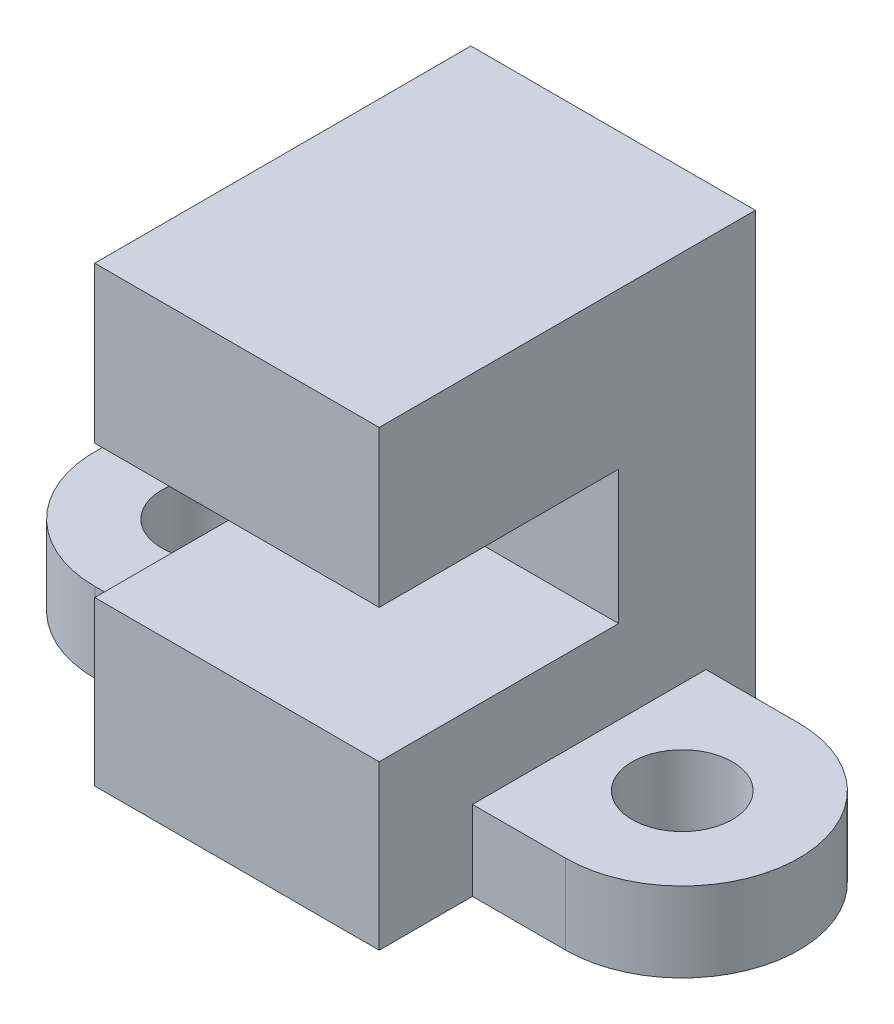
ISO-10303-21;
HEADER;
FILE_DESCRIPTION(('STEP AP214'),'2;1');
FILE_NAME('part.step','',(''),(''),'','','');
FILE_SCHEMA(('AUTOMOTIVE_DESIGN { 1 0 10303 214 1 1 1 1 }'));
ENDSEC;
DATA;
#1=APPLICATION_CONTEXT('core data for automotive mechanical design processes');
#2=APPLICATION_PROTOCOL_DEFINITION('international standard','automotive_design',2000,#1);
#3=PRODUCT_CONTEXT('',#1,'mechanical');
#4=PRODUCT('Part','Part','',(#3));
#5=PRODUCT_RELATED_PRODUCT_CATEGORY('part','',(#4));
#6=PRODUCT_DEFINITION_FORMATION('','',#4);
#7=PRODUCT_DEFINITION_CONTEXT('part definition',#1,'design');
#8=PRODUCT_DEFINITION('design','',#6,#7);
#9=PRODUCT_DEFINITION_SHAPE('','',#8);
#10=(LENGTH_UNIT() NAMED_UNIT(*) SI_UNIT(.MILLI.,.METRE.));
#11=(NAMED_UNIT(*) PLANE_ANGLE_UNIT() SI_UNIT($,.RADIAN.));
#12=(NAMED_UNIT(*) SI_UNIT($,.STERADIAN.) SOLID_ANGLE_UNIT());
#13=UNCERTAINTY_MEASURE_WITH_UNIT(LENGTH_MEASURE(1.E-05),#10,'distance_accuracy_value','');
#14=(GEOMETRIC_REPRESENTATION_CONTEXT(3) GLOBAL_UNCERTAINTY_ASSIGNED_CONTEXT((#13)) GLOBAL_UNIT_ASSIGNED_CONTEXT((#10,
#11,#12)) REPRESENTATION_CONTEXT('',''));
#15=CARTESIAN_POINT('',(0.,0.,0.));
#16=DIRECTION('',(0.,0.,1.));
#17=DIRECTION('',(1.,0.,0.));
#18=AXIS2_PLACEMENT_3D('',#15,#16,#17);
#19=CARTESIAN_POINT('',(-3.66,5.825,3.52));
#20=DIRECTION('',(1.,0.,0.));
#21=DIRECTION('',(0.,1.,0.));
#22=AXIS2_PLACEMENT_3D('',#19,#20,#21);
#23=PLANE('',#22);
#24=DIRECTION('',(0.,-1.,0.));
#25=VECTOR('',#24,1.);
#26=CARTESIAN_POINT('',(-3.66,-3.775,1.27));
#27=LINE('',#26,#25);
#28=CARTESIAN_POINT('',(-3.66,-3.775,1.27));
#29=VERTEX_POINT('',#28);
#30=CARTESIAN_POINT('',(-3.66,-5.825,1.27));
#31=VERTEX_POINT('',#30);
#32=EDGE_CURVE('E163',#29,#31,#27,.T.);
#33=ORIENTED_EDGE('',*,*,#32,.F.);
#34=DIRECTION('',(0.,0.,-1.));
#35=VECTOR('',#34,1.);
#36=CARTESIAN_POINT('',(-3.66,-3.775,0.));
#37=LINE('',#36,#35);
#38=CARTESIAN_POINT('',(-3.66,-3.775,7.28));
#39=VERTEX_POINT('',#38);
#40=EDGE_CURVE('E177',#39,#29,#37,.T.);
#41=ORIENTED_EDGE('',*,*,#40,.F.);
#42=DIRECTION('',(0.,-1.,0.));
#43=VECTOR('',#42,1.);
#44=CARTESIAN_POINT('',(-3.66,-3.775,7.28));
#45=LINE('',#44,#43);
#46=CARTESIAN_POINT('',(-3.66,-5.825,7.28));
#47=VERTEX_POINT('',#46);
#48=EDGE_CURVE('E193',#39,#47,#45,.T.);
#49=ORIENTED_EDGE('',*,*,#48,.T.);
#50=DIRECTION('',(0.,0.,-1.));
#51=VECTOR('',#50,1.);
#52=CARTESIAN_POINT('',(-3.66,-5.825,3.52));
#53=LINE('',#52,#51);
#54=CARTESIAN_POINT('',(-3.66,-5.825,9.68));
#55=VERTEX_POINT('',#54);
#56=EDGE_CURVE('E285',#55,#47,#53,.T.);
#57=ORIENTED_EDGE('',*,*,#56,.F.);
#58=DIRECTION('',(0.,-1.,0.));
#59=VECTOR('',#58,1.);
#60=CARTESIAN_POINT('',(-3.66,-5.825,9.68));
#61=LINE('',#60,#59);
#62=CARTESIAN_POINT('',(-3.66,-1.625,9.68));
#63=VERTEX_POINT('',#62);
#64=EDGE_CURVE('E247',#63,#55,#61,.T.);
#65=ORIENTED_EDGE('',*,*,#64,.F.);
#66=DIRECTION('',(0.,0.,-1.));
#67=VECTOR('',#66,1.);
#68=CARTESIAN_POINT('',(-3.66,-1.625,9.68));
#69=LINE('',#68,#67);
#70=CARTESIAN_POINT('',(-3.66,-1.625,3.52));
#71=VERTEX_POINT('',#70);
#72=EDGE_CURVE('E257',#63,#71,#69,.T.);
#73=ORIENTED_EDGE('',*,*,#72,.T.);
#74=DIRECTION('',(0.,-1.,0.));
#75=VECTOR('',#74,1.);
#76=CARTESIAN_POINT('',(-3.66,5.825,3.52));
#77=LINE('',#76,#75);
#78=CARTESIAN_POINT('',(-3.66,1.815,3.52));
#79=VERTEX_POINT('',#78);
#80=EDGE_CURVE('E268',#79,#71,#77,.T.);
#81=ORIENTED_EDGE('',*,*,#80,.F.);
#82=DIRECTION('',(0.,0.,-1.));
#83=VECTOR('',#82,1.);
#84=CARTESIAN_POINT('',(-3.66,1.815,9.68));
#85=LINE('',#84,#83);
#86=CARTESIAN_POINT('',(-3.66,1.815,9.68));
#87=VERTEX_POINT('',#86);
#88=EDGE_CURVE('E243',#87,#79,#85,.T.);
#89=ORIENTED_EDGE('',*,*,#88,.F.);
#90=DIRECTION('',(0.,-1.,0.));
#91=VECTOR('',#90,1.);
#92=CARTESIAN_POINT('',(-3.66,5.825,9.68));
#93=LINE('',#92,#91);
#94=CARTESIAN_POINT('',(-3.66,5.825,9.68));
#95=VERTEX_POINT('',#94);
#96=EDGE_CURVE('E227',#95,#87,#93,.T.);
#97=ORIENTED_EDGE('',*,*,#96,.F.);
#98=DIRECTION('',(0.,0.,-1.));
#99=VECTOR('',#98,1.);
#100=CARTESIAN_POINT('',(-3.66,5.825,3.52));
#101=LINE('',#100,#99);
#102=CARTESIAN_POINT('',(-3.66,5.825,0.));
#103=VERTEX_POINT('',#102);
#104=EDGE_CURVE('E45',#95,#103,#101,.T.);
#105=ORIENTED_EDGE('',*,*,#104,.T.);
#106=DIRECTION('',(0.,-1.,0.));
#107=VECTOR('',#106,1.);
#108=CARTESIAN_POINT('',(-3.66,5.825,0.));
#109=LINE('',#108,#107);
#110=CARTESIAN_POINT('',(-3.66,-5.825,0.));
#111=VERTEX_POINT('',#110);
#112=EDGE_CURVE('E276',#103,#111,#109,.T.);
#113=ORIENTED_EDGE('',*,*,#112,.T.);
#114=EDGE_CURVE('E284',#31,#111,#53,.T.);
#115=ORIENTED_EDGE('',*,*,#114,.F.);
#116=EDGE_LOOP('',(#33,#41,#49,#57,#65,#73,#81,#89,#97,#105,#113,#115));
#117=FACE_BOUND('',#116,.T.);
#118=ADVANCED_FACE('F37',(#117),#23,.F.);
#119=CARTESIAN_POINT('',(3.66,5.825,3.52));
#120=DIRECTION('',(-1.,0.,0.));
#121=DIRECTION('',(0.,-1.,0.));
#122=AXIS2_PLACEMENT_3D('',#119,#120,#121);
#123=PLANE('',#122);
#124=DIRECTION('',(0.,-1.,0.));
#125=VECTOR('',#124,1.);
#126=CARTESIAN_POINT('',(3.66,-3.775,7.28));
#127=LINE('',#126,#125);
#128=CARTESIAN_POINT('',(3.66,-3.775,7.28));
#129=VERTEX_POINT('',#128);
#130=CARTESIAN_POINT('',(3.66,-5.825,7.28));
#131=VERTEX_POINT('',#130);
#132=EDGE_CURVE('E222',#129,#131,#127,.T.);
#133=ORIENTED_EDGE('',*,*,#132,.F.);
#134=DIRECTION('',(0.,0.,1.));
#135=VECTOR('',#134,1.);
#136=CARTESIAN_POINT('',(3.66,-3.775,0.));
#137=LINE('',#136,#135);
#138=CARTESIAN_POINT('',(3.66,-3.775,1.27));
#139=VERTEX_POINT('',#138);
#140=EDGE_CURVE('E208',#139,#129,#137,.T.);
#141=ORIENTED_EDGE('',*,*,#140,.F.);
#142=DIRECTION('',(0.,-1.,0.));
#143=VECTOR('',#142,1.);
#144=CARTESIAN_POINT('',(3.66,-3.775,1.27));
#145=LINE('',#144,#143);
#146=CARTESIAN_POINT('',(3.66,-5.825,1.27));
#147=VERTEX_POINT('',#146);
#148=EDGE_CURVE('E219',#139,#147,#145,.T.);
#149=ORIENTED_EDGE('',*,*,#148,.T.);
#150=DIRECTION('',(0.,0.,-1.));
#151=VECTOR('',#150,1.);
#152=CARTESIAN_POINT('',(3.66,-5.825,3.52));
#153=LINE('',#152,#151);
#154=CARTESIAN_POINT('',(3.66,-5.825,0.));
#155=VERTEX_POINT('',#154);
#156=EDGE_CURVE('E271',#147,#155,#153,.T.);
#157=ORIENTED_EDGE('',*,*,#156,.T.);
#158=DIRECTION('',(0.,1.,0.));
#159=VECTOR('',#158,1.);
#160=CARTESIAN_POINT('',(3.66,5.825,0.));
#161=LINE('',#160,#159);
#162=CARTESIAN_POINT('',(3.66,5.825,0.));
#163=VERTEX_POINT('',#162);
#164=EDGE_CURVE('E265',#155,#163,#161,.T.);
#165=ORIENTED_EDGE('',*,*,#164,.T.);
#166=DIRECTION('',(0.,0.,-1.));
#167=VECTOR('',#166,1.);
#168=CARTESIAN_POINT('',(3.66,5.825,3.52));
#169=LINE('',#168,#167);
#170=CARTESIAN_POINT('',(3.66,5.825,9.68));
#171=VERTEX_POINT('',#170);
#172=EDGE_CURVE('E11',#171,#163,#169,.T.);
#173=ORIENTED_EDGE('',*,*,#172,.F.);
#174=DIRECTION('',(0.,1.,0.));
#175=VECTOR('',#174,1.);
#176=CARTESIAN_POINT('',(3.66,5.825,9.68));
#177=LINE('',#176,#175);
#178=CARTESIAN_POINT('',(3.66,1.815,9.68));
#179=VERTEX_POINT('',#178);
#180=EDGE_CURVE('E232',#179,#171,#177,.T.);
#181=ORIENTED_EDGE('',*,*,#180,.F.);
#182=DIRECTION('',(0.,0.,-1.));
#183=VECTOR('',#182,1.);
#184=CARTESIAN_POINT('',(3.66,1.815,9.68));
#185=LINE('',#184,#183);
#186=CARTESIAN_POINT('',(3.66,1.815,3.52));
#187=VERTEX_POINT('',#186);
#188=EDGE_CURVE('E238',#179,#187,#185,.T.);
#189=ORIENTED_EDGE('',*,*,#188,.T.);
#190=DIRECTION('',(0.,1.,0.));
#191=VECTOR('',#190,1.);
#192=CARTESIAN_POINT('',(3.66,5.825,3.52));
#193=LINE('',#192,#191);
#194=CARTESIAN_POINT('',(3.66,-1.625,3.52));
#195=VERTEX_POINT('',#194);
#196=EDGE_CURVE('E266',#195,#187,#193,.T.);
#197=ORIENTED_EDGE('',*,*,#196,.F.);
#198=DIRECTION('',(0.,0.,-1.));
#199=VECTOR('',#198,1.);
#200=CARTESIAN_POINT('',(3.66,-1.625,9.68));
#201=LINE('',#200,#199);
#202=CARTESIAN_POINT('',(3.66,-1.625,9.68));
#203=VERTEX_POINT('',#202);
#204=EDGE_CURVE('E262',#203,#195,#201,.T.);
#205=ORIENTED_EDGE('',*,*,#204,.F.);
#206=DIRECTION('',(0.,1.,0.));
#207=VECTOR('',#206,1.);
#208=CARTESIAN_POINT('',(3.66,-5.825,9.68));
#209=LINE('',#208,#207);
#210=CARTESIAN_POINT('',(3.66,-5.825,9.68));
#211=VERTEX_POINT('',#210);
#212=EDGE_CURVE('E253',#211,#203,#209,.T.);
#213=ORIENTED_EDGE('',*,*,#212,.F.);
#214=EDGE_CURVE('E281',#211,#131,#153,.T.);
#215=ORIENTED_EDGE('',*,*,#214,.T.);
#216=EDGE_LOOP('',(#133,#141,#149,#157,#165,#173,#181,#189,#197,#205,#213,#215));
#217=FACE_BOUND('',#216,.T.);
#218=ADVANCED_FACE('F39',(#217),#123,.F.);
#219=CARTESIAN_POINT('',(0.,0.,3.52));
#220=DIRECTION('',(0.,0.,1.));
#221=DIRECTION('',(1.,0.,0.));
#222=AXIS2_PLACEMENT_3D('',#219,#220,#221);
#223=PLANE('',#222);
#224=ORIENTED_EDGE('',*,*,#196,.T.);
#225=DIRECTION('',(1.,0.,0.));
#226=VECTOR('',#225,1.);
#227=CARTESIAN_POINT('',(-3.66,1.815,3.52));
#228=LINE('',#227,#226);
#229=EDGE_CURVE('E221',#79,#187,#228,.T.);
#230=ORIENTED_EDGE('',*,*,#229,.F.);
#231=ORIENTED_EDGE('',*,*,#80,.T.);
#232=DIRECTION('',(-1.,0.,0.));
#233=VECTOR('',#232,1.);
#234=CARTESIAN_POINT('',(-3.66,-1.625,3.52));
#235=LINE('',#234,#233);
#236=EDGE_CURVE('E246',#195,#71,#235,.T.);
#237=ORIENTED_EDGE('',*,*,#236,.F.);
#238=EDGE_LOOP('',(#224,#230,#231,#237));
#239=FACE_BOUND('',#238,.T.);
#240=ADVANCED_FACE('F316',(#239),#223,.T.);
#241=CARTESIAN_POINT('',(-3.66,5.825,3.52));
#242=DIRECTION('',(0.,-1.,0.));
#243=DIRECTION('',(0.,0.,-1.));
#244=AXIS2_PLACEMENT_3D('',#241,#242,#243);
#245=PLANE('',#244);
#246=DIRECTION('',(-1.,0.,0.));
#247=VECTOR('',#246,1.);
#248=CARTESIAN_POINT('',(-3.66,5.825,0.));
#249=LINE('',#248,#247);
#250=EDGE_CURVE('E274',#163,#103,#249,.T.);
#251=ORIENTED_EDGE('',*,*,#250,.T.);
#252=ORIENTED_EDGE('',*,*,#104,.F.);
#253=DIRECTION('',(-1.,0.,0.));
#254=VECTOR('',#253,1.);
#255=CARTESIAN_POINT('',(-3.66,5.825,9.68));
#256=LINE('',#255,#254);
#257=EDGE_CURVE('E235',#171,#95,#256,.T.);
#258=ORIENTED_EDGE('',*,*,#257,.F.);
#259=ORIENTED_EDGE('',*,*,#172,.T.);
#260=EDGE_LOOP('',(#251,#252,#258,#259));
#261=FACE_BOUND('',#260,.T.);
#262=ADVANCED_FACE('F325',(#261),#245,.F.);
#263=CARTESIAN_POINT('',(-3.66,-5.825,3.52));
#264=DIRECTION('',(0.,1.,0.));
#265=DIRECTION('',(0.,0.,1.));
#266=AXIS2_PLACEMENT_3D('',#263,#264,#265);
#267=PLANE('',#266);
#268=DIRECTION('',(1.,0.,0.));
#269=VECTOR('',#268,1.);
#270=CARTESIAN_POINT('',(-3.66,-5.825,0.));
#271=LINE('',#270,#269);
#272=EDGE_CURVE('E269',#111,#155,#271,.T.);
#273=ORIENTED_EDGE('',*,*,#272,.T.);
#274=ORIENTED_EDGE('',*,*,#156,.F.);
#275=DIRECTION('',(-1.,0.,0.));
#276=VECTOR('',#275,1.);
#277=CARTESIAN_POINT('',(0.,-5.825,1.27000000000001));
#278=LINE('',#277,#276);
#279=CARTESIAN_POINT('',(6.0536210999594,-5.825,1.27));
#280=VERTEX_POINT('',#279);
#281=EDGE_CURVE('E60',#280,#147,#278,.T.);
#282=ORIENTED_EDGE('',*,*,#281,.F.);
#283=CARTESIAN_POINT('',(6.0536210999594,-5.825,4.275));
#284=DIRECTION('',(0.,-1.,0.));
#285=DIRECTION('',(0.,0.,-1.));
#286=AXIS2_PLACEMENT_3D('',#283,#284,#285);
#287=CIRCLE('',#286,3.005);
#288=CARTESIAN_POINT('',(6.0536210999594,-5.825,7.28));
#289=VERTEX_POINT('',#288);
#290=EDGE_CURVE('E214',#280,#289,#287,.T.);
#291=ORIENTED_EDGE('',*,*,#290,.T.);
#292=DIRECTION('',(-1.,0.,0.));
#293=VECTOR('',#292,1.);
#294=CARTESIAN_POINT('',(0.,-5.825,7.28));
#295=LINE('',#294,#293);
#296=EDGE_CURVE('E200',#289,#131,#295,.T.);
#297=ORIENTED_EDGE('',*,*,#296,.T.);
#298=ORIENTED_EDGE('',*,*,#214,.F.);
#299=DIRECTION('',(1.,0.,0.));
#300=VECTOR('',#299,1.);
#301=CARTESIAN_POINT('',(-3.66,-5.825,9.68));
#302=LINE('',#301,#300);
#303=EDGE_CURVE('E250',#55,#211,#302,.T.);
#304=ORIENTED_EDGE('',*,*,#303,.F.);
#305=ORIENTED_EDGE('',*,*,#56,.T.);
#306=DIRECTION('',(1.,0.,0.));
#307=VECTOR('',#306,1.);
#308=CARTESIAN_POINT('',(0.,-5.825,7.28));
#309=LINE('',#308,#307);
#310=CARTESIAN_POINT('',(-6.05362109995939,-5.825,7.28000000000001));
#311=VERTEX_POINT('',#310);
#312=EDGE_CURVE('E52',#311,#47,#309,.T.);
#313=ORIENTED_EDGE('',*,*,#312,.F.);
#314=CARTESIAN_POINT('',(-6.05362109995939,-5.825,4.275));
#315=DIRECTION('',(0.,-1.,0.));
#316=DIRECTION('',(0.,0.,-1.));
#317=AXIS2_PLACEMENT_3D('',#314,#315,#316);
#318=CIRCLE('',#317,3.005);
#319=CARTESIAN_POINT('',(-6.05362109995939,-5.825,1.27));
#320=VERTEX_POINT('',#319);
#321=EDGE_CURVE('E185',#320,#311,#318,.F.);
#322=ORIENTED_EDGE('',*,*,#321,.F.);
#323=DIRECTION('',(1.,0.,0.));
#324=VECTOR('',#323,1.);
#325=CARTESIAN_POINT('',(0.,-5.825,1.27000000000001));
#326=LINE('',#325,#324);
#327=EDGE_CURVE('E159',#320,#31,#326,.T.);
#328=ORIENTED_EDGE('',*,*,#327,.T.);
#329=ORIENTED_EDGE('',*,*,#114,.T.);
#330=EDGE_LOOP('',(#273,#274,#282,#291,#297,#298,#304,#305,#313,#322,#328,#329));
#331=FACE_BOUND('',#330,.T.);
#332=CARTESIAN_POINT('',(6.0536210999594,-5.825,4.275));
#333=DIRECTION('',(0.,-1.,0.));
#334=DIRECTION('',(0.,0.,-1.));
#335=AXIS2_PLACEMENT_3D('',#332,#333,#334);
#336=CIRCLE('',#335,1.29);
#337=CARTESIAN_POINT('',(6.0536210999594,-5.825,2.985));
#338=VERTEX_POINT('',#337);
#339=EDGE_CURVE('E192',#338,#338,#336,.T.);
#340=ORIENTED_EDGE('',*,*,#339,.F.);
#341=EDGE_LOOP('',(#340));
#342=FACE_BOUND('',#341,.T.);
#343=CARTESIAN_POINT('',(-6.05362109995939,-5.825,4.275));
#344=DIRECTION('',(0.,-1.,0.));
#345=DIRECTION('',(0.,0.,-1.));
#346=AXIS2_PLACEMENT_3D('',#343,#344,#345);
#347=CIRCLE('',#346,1.29);
#348=CARTESIAN_POINT('',(-6.05362109995939,-5.825,2.98500000000001));
#349=VERTEX_POINT('',#348);
#350=EDGE_CURVE('E172',#349,#349,#347,.F.);
#351=ORIENTED_EDGE('',*,*,#350,.T.);
#352=EDGE_LOOP('',(#351));
#353=FACE_BOUND('',#352,.T.);
#354=ADVANCED_FACE('F301',(#331,#342,#353),#267,.F.);
#355=CARTESIAN_POINT('',(0.,0.,0.));
#356=DIRECTION('',(0.,0.,1.));
#357=DIRECTION('',(1.,0.,0.));
#358=AXIS2_PLACEMENT_3D('',#355,#356,#357);
#359=PLANE('',#358);
#360=ORIENTED_EDGE('',*,*,#164,.F.);
#361=ORIENTED_EDGE('',*,*,#272,.F.);
#362=ORIENTED_EDGE('',*,*,#112,.F.);
#363=ORIENTED_EDGE('',*,*,#250,.F.);
#364=EDGE_LOOP('',(#360,#361,#362,#363));
#365=FACE_BOUND('',#364,.T.);
#366=ADVANCED_FACE('F298',(#365),#359,.F.);
#367=CARTESIAN_POINT('',(-3.66,-1.625,9.68));
#368=DIRECTION('',(0.,-1.,0.));
#369=DIRECTION('',(0.,0.,-1.));
#370=AXIS2_PLACEMENT_3D('',#367,#368,#369);
#371=PLANE('',#370);
#372=ORIENTED_EDGE('',*,*,#236,.T.);
#373=ORIENTED_EDGE('',*,*,#72,.F.);
#374=DIRECTION('',(-1.,0.,0.));
#375=VECTOR('',#374,1.);
#376=CARTESIAN_POINT('',(-3.66,-1.625,9.68));
#377=LINE('',#376,#375);
#378=EDGE_CURVE('E255',#203,#63,#377,.T.);
#379=ORIENTED_EDGE('',*,*,#378,.F.);
#380=ORIENTED_EDGE('',*,*,#204,.T.);
#381=EDGE_LOOP('',(#372,#373,#379,#380));
#382=FACE_BOUND('',#381,.T.);
#383=ADVANCED_FACE('F312',(#382),#371,.F.);
#384=CARTESIAN_POINT('',(0.,0.,9.68));
#385=DIRECTION('',(0.,0.,-1.));
#386=DIRECTION('',(-1.,0.,0.));
#387=AXIS2_PLACEMENT_3D('',#384,#385,#386);
#388=PLANE('',#387);
#389=ORIENTED_EDGE('',*,*,#64,.T.);
#390=ORIENTED_EDGE('',*,*,#303,.T.);
#391=ORIENTED_EDGE('',*,*,#212,.T.);
#392=ORIENTED_EDGE('',*,*,#378,.T.);
#393=EDGE_LOOP('',(#389,#390,#391,#392));
#394=FACE_BOUND('',#393,.T.);
#395=ADVANCED_FACE('F307',(#394),#388,.F.);
#396=CARTESIAN_POINT('',(-3.66,1.815,9.68));
#397=DIRECTION('',(0.,1.,0.));
#398=DIRECTION('',(0.,0.,1.));
#399=AXIS2_PLACEMENT_3D('',#396,#397,#398);
#400=PLANE('',#399);
#401=ORIENTED_EDGE('',*,*,#229,.T.);
#402=ORIENTED_EDGE('',*,*,#188,.F.);
#403=DIRECTION('',(1.,0.,0.));
#404=VECTOR('',#403,1.);
#405=CARTESIAN_POINT('',(-3.66,1.815,9.68));
#406=LINE('',#405,#404);
#407=EDGE_CURVE('E230',#87,#179,#406,.T.);
#408=ORIENTED_EDGE('',*,*,#407,.F.);
#409=ORIENTED_EDGE('',*,*,#88,.T.);
#410=EDGE_LOOP('',(#401,#402,#408,#409));
#411=FACE_BOUND('',#410,.T.);
#412=ADVANCED_FACE('F322',(#411),#400,.F.);
#413=CARTESIAN_POINT('',(0.,0.,9.68));
#414=DIRECTION('',(0.,0.,1.));
#415=DIRECTION('',(1.,0.,0.));
#416=AXIS2_PLACEMENT_3D('',#413,#414,#415);
#417=PLANE('',#416);
#418=ORIENTED_EDGE('',*,*,#96,.T.);
#419=ORIENTED_EDGE('',*,*,#407,.T.);
#420=ORIENTED_EDGE('',*,*,#180,.T.);
#421=ORIENTED_EDGE('',*,*,#257,.T.);
#422=EDGE_LOOP('',(#418,#419,#420,#421));
#423=FACE_BOUND('',#422,.T.);
#424=ADVANCED_FACE('F324',(#423),#417,.T.);
#425=CARTESIAN_POINT('',(0.,-3.775,1.27000000000001));
#426=DIRECTION('',(0.,0.,1.));
#427=DIRECTION('',(1.,0.,0.));
#428=AXIS2_PLACEMENT_3D('',#425,#426,#427);
#429=PLANE('',#428);
#430=ORIENTED_EDGE('',*,*,#281,.T.);
#431=ORIENTED_EDGE('',*,*,#148,.F.);
#432=DIRECTION('',(-1.,0.,0.));
#433=VECTOR('',#432,1.);
#434=CARTESIAN_POINT('',(0.,-3.775,1.27000000000001));
#435=LINE('',#434,#433);
#436=CARTESIAN_POINT('',(6.0536210999594,-3.775,1.27));
#437=VERTEX_POINT('',#436);
#438=EDGE_CURVE('E199',#437,#139,#435,.T.);
#439=ORIENTED_EDGE('',*,*,#438,.F.);
#440=DIRECTION('',(0.,-1.,0.));
#441=VECTOR('',#440,1.);
#442=CARTESIAN_POINT('',(6.0536210999594,-3.775,1.27));
#443=LINE('',#442,#441);
#444=EDGE_CURVE('E210',#437,#280,#443,.T.);
#445=ORIENTED_EDGE('',*,*,#444,.T.);
#446=EDGE_LOOP('',(#430,#431,#439,#445));
#447=FACE_BOUND('',#446,.T.);
#448=ADVANCED_FACE('F328',(#447),#429,.F.);
#449=CARTESIAN_POINT('',(0.,-3.775,7.28));
#450=DIRECTION('',(0.,0.,1.));
#451=DIRECTION('',(1.,0.,0.));
#452=AXIS2_PLACEMENT_3D('',#449,#450,#451);
#453=PLANE('',#452);
#454=ORIENTED_EDGE('',*,*,#296,.F.);
#455=DIRECTION('',(0.,-1.,0.));
#456=VECTOR('',#455,1.);
#457=CARTESIAN_POINT('',(6.0536210999594,-3.775,7.28));
#458=LINE('',#457,#456);
#459=CARTESIAN_POINT('',(6.0536210999594,-3.775,7.28));
#460=VERTEX_POINT('',#459);
#461=EDGE_CURVE('E224',#460,#289,#458,.T.);
#462=ORIENTED_EDGE('',*,*,#461,.F.);
#463=DIRECTION('',(-1.,0.,0.));
#464=VECTOR('',#463,1.);
#465=CARTESIAN_POINT('',(0.,-3.775,7.28));
#466=LINE('',#465,#464);
#467=EDGE_CURVE('E205',#460,#129,#466,.T.);
#468=ORIENTED_EDGE('',*,*,#467,.T.);
#469=ORIENTED_EDGE('',*,*,#132,.T.);
#470=EDGE_LOOP('',(#454,#462,#468,#469));
#471=FACE_BOUND('',#470,.T.);
#472=ADVANCED_FACE('F338',(#471),#453,.T.);
#473=CARTESIAN_POINT('',(6.0536210999594,-3.775,4.275));
#474=DIRECTION('',(0.,-1.,0.));
#475=DIRECTION('',(0.,0.,-1.));
#476=AXIS2_PLACEMENT_3D('',#473,#474,#475);
#477=CYLINDRICAL_SURFACE('',#476,1.29);
#478=CARTESIAN_POINT('',(6.0536210999594,-3.775,4.275));
#479=DIRECTION('',(0.,-1.,0.));
#480=DIRECTION('',(0.,0.,-1.));
#481=AXIS2_PLACEMENT_3D('',#478,#479,#480);
#482=CIRCLE('',#481,1.29);
#483=CARTESIAN_POINT('',(6.0536210999594,-3.775,2.985));
#484=VERTEX_POINT('',#483);
#485=EDGE_CURVE('E196',#484,#484,#482,.T.);
#486=ORIENTED_EDGE('',*,*,#485,.F.);
#487=EDGE_LOOP('',(#486));
#488=FACE_BOUND('',#487,.T.);
#489=ORIENTED_EDGE('',*,*,#339,.T.);
#490=EDGE_LOOP('',(#489));
#491=FACE_BOUND('',#490,.T.);
#492=ADVANCED_FACE('F340',(#488,#491),#477,.F.);
#493=CARTESIAN_POINT('',(6.0536210999594,-3.775,4.275));
#494=DIRECTION('',(0.,-1.,0.));
#495=DIRECTION('',(0.,0.,-1.));
#496=AXIS2_PLACEMENT_3D('',#493,#494,#495);
#497=CYLINDRICAL_SURFACE('',#496,3.005);
#498=ORIENTED_EDGE('',*,*,#290,.F.);
#499=ORIENTED_EDGE('',*,*,#444,.F.);
#500=CARTESIAN_POINT('',(6.0536210999594,-3.775,4.275));
#501=DIRECTION('',(0.,-1.,0.));
#502=DIRECTION('',(0.,0.,-1.));
#503=AXIS2_PLACEMENT_3D('',#500,#501,#502);
#504=CIRCLE('',#503,3.005);
#505=EDGE_CURVE('E202',#437,#460,#504,.T.);
#506=ORIENTED_EDGE('',*,*,#505,.T.);
#507=ORIENTED_EDGE('',*,*,#461,.T.);
#508=EDGE_LOOP('',(#498,#499,#506,#507));
#509=FACE_BOUND('',#508,.T.);
#510=ADVANCED_FACE('F335',(#509),#497,.T.);
#511=CARTESIAN_POINT('',(0.,-3.775,0.));
#512=DIRECTION('',(0.,-1.,0.));
#513=DIRECTION('',(0.,0.,-1.));
#514=AXIS2_PLACEMENT_3D('',#511,#512,#513);
#515=PLANE('',#514);
#516=ORIENTED_EDGE('',*,*,#485,.T.);
#517=EDGE_LOOP('',(#516));
#518=FACE_BOUND('',#517,.T.);
#519=ORIENTED_EDGE('',*,*,#438,.T.);
#520=ORIENTED_EDGE('',*,*,#140,.T.);
#521=ORIENTED_EDGE('',*,*,#467,.F.);
#522=ORIENTED_EDGE('',*,*,#505,.F.);
#523=EDGE_LOOP('',(#519,#520,#521,#522));
#524=FACE_BOUND('',#523,.T.);
#525=ADVANCED_FACE('F332',(#518,#524),#515,.F.);
#526=CARTESIAN_POINT('',(-6.05362109995939,-3.775,4.275));
#527=DIRECTION('',(0.,-1.,0.));
#528=DIRECTION('',(0.,0.,-1.));
#529=AXIS2_PLACEMENT_3D('',#526,#527,#528);
#530=CYLINDRICAL_SURFACE('',#529,3.005);
#531=ORIENTED_EDGE('',*,*,#321,.T.);
#532=DIRECTION('',(0.,-1.,0.));
#533=VECTOR('',#532,1.);
#534=CARTESIAN_POINT('',(-6.05362109995939,-3.775,7.28000000000001));
#535=LINE('',#534,#533);
#536=CARTESIAN_POINT('',(-6.05362109995939,-3.775,7.28000000000001));
#537=VERTEX_POINT('',#536);
#538=EDGE_CURVE('E170',#537,#311,#535,.T.);
#539=ORIENTED_EDGE('',*,*,#538,.F.);
#540=CARTESIAN_POINT('',(-6.05362109995939,-3.775,4.275));
#541=DIRECTION('',(0.,-1.,0.));
#542=DIRECTION('',(0.,0.,-1.));
#543=AXIS2_PLACEMENT_3D('',#540,#541,#542);
#544=CIRCLE('',#543,3.005);
#545=CARTESIAN_POINT('',(-6.05362109995939,-3.775,1.27));
#546=VERTEX_POINT('',#545);
#547=EDGE_CURVE('E168',#546,#537,#544,.F.);
#548=ORIENTED_EDGE('',*,*,#547,.F.);
#549=DIRECTION('',(0.,-1.,0.));
#550=VECTOR('',#549,1.);
#551=CARTESIAN_POINT('',(-6.05362109995939,-3.775,1.27));
#552=LINE('',#551,#550);
#553=EDGE_CURVE('E152',#546,#320,#552,.T.);
#554=ORIENTED_EDGE('',*,*,#553,.T.);
#555=EDGE_LOOP('',(#531,#539,#548,#554));
#556=FACE_BOUND('',#555,.T.);
#557=ADVANCED_FACE('F169',(#556),#530,.T.);
#558=CARTESIAN_POINT('',(0.,-3.775,7.28));
#559=DIRECTION('',(0.,0.,-1.));
#560=DIRECTION('',(-1.,0.,0.));
#561=AXIS2_PLACEMENT_3D('',#558,#559,#560);
#562=PLANE('',#561);
#563=ORIENTED_EDGE('',*,*,#312,.T.);
#564=ORIENTED_EDGE('',*,*,#48,.F.);
#565=DIRECTION('',(1.,0.,0.));
#566=VECTOR('',#565,1.);
#567=CARTESIAN_POINT('',(0.,-3.775,7.28));
#568=LINE('',#567,#566);
#569=EDGE_CURVE('E179',#537,#39,#568,.T.);
#570=ORIENTED_EDGE('',*,*,#569,.F.);
#571=ORIENTED_EDGE('',*,*,#538,.T.);
#572=EDGE_LOOP('',(#563,#564,#570,#571));
#573=FACE_BOUND('',#572,.T.);
#574=ADVANCED_FACE('F389',(#573),#562,.F.);
#575=CARTESIAN_POINT('',(0.,-3.775,1.27000000000001));
#576=DIRECTION('',(0.,0.,-1.));
#577=DIRECTION('',(-1.,0.,0.));
#578=AXIS2_PLACEMENT_3D('',#575,#576,#577);
#579=PLANE('',#578);
#580=ORIENTED_EDGE('',*,*,#327,.F.);
#581=ORIENTED_EDGE('',*,*,#553,.F.);
#582=DIRECTION('',(1.,0.,0.));
#583=VECTOR('',#582,1.);
#584=CARTESIAN_POINT('',(0.,-3.775,1.27000000000001));
#585=LINE('',#584,#583);
#586=EDGE_CURVE('E156',#546,#29,#585,.T.);
#587=ORIENTED_EDGE('',*,*,#586,.T.);
#588=ORIENTED_EDGE('',*,*,#32,.T.);
#589=EDGE_LOOP('',(#580,#581,#587,#588));
#590=FACE_BOUND('',#589,.T.);
#591=ADVANCED_FACE('F154',(#590),#579,.T.);
#592=CARTESIAN_POINT('',(-6.05362109995939,-3.775,4.275));
#593=DIRECTION('',(0.,-1.,0.));
#594=DIRECTION('',(0.,0.,-1.));
#595=AXIS2_PLACEMENT_3D('',#592,#593,#594);
#596=CYLINDRICAL_SURFACE('',#595,1.29);
#597=CARTESIAN_POINT('',(-6.05362109995939,-3.775,4.275));
#598=DIRECTION('',(0.,-1.,0.));
#599=DIRECTION('',(0.,0.,-1.));
#600=AXIS2_PLACEMENT_3D('',#597,#598,#599);
#601=CIRCLE('',#600,1.29);
#602=CARTESIAN_POINT('',(-6.05362109995939,-3.775,2.98500000000001));
#603=VERTEX_POINT('',#602);
#604=EDGE_CURVE('E164',#603,#603,#601,.F.);
#605=ORIENTED_EDGE('',*,*,#604,.T.);
#606=EDGE_LOOP('',(#605));
#607=FACE_BOUND('',#606,.T.);
#608=ORIENTED_EDGE('',*,*,#350,.F.);
#609=EDGE_LOOP('',(#608));
#610=FACE_BOUND('',#609,.T.);
#611=ADVANCED_FACE('F394',(#607,#610),#596,.F.);
#612=CARTESIAN_POINT('',(0.,-3.775,0.));
#613=DIRECTION('',(0.,-1.,0.));
#614=DIRECTION('',(0.,0.,-1.));
#615=AXIS2_PLACEMENT_3D('',#612,#613,#614);
#616=PLANE('',#615);
#617=ORIENTED_EDGE('',*,*,#547,.T.);
#618=ORIENTED_EDGE('',*,*,#569,.T.);
#619=ORIENTED_EDGE('',*,*,#40,.T.);
#620=ORIENTED_EDGE('',*,*,#586,.F.);
#621=EDGE_LOOP('',(#617,#618,#619,#620));
#622=FACE_BOUND('',#621,.T.);
#623=ORIENTED_EDGE('',*,*,#604,.F.);
#624=EDGE_LOOP('',(#623));
#625=FACE_BOUND('',#624,.T.);
#626=ADVANCED_FACE('F174',(#622,#625),#616,.F.);
#627=CLOSED_SHELL('',(#118,#218,#240,#262,#354,#366,#383,#395,#412,#424,#448,#472,#492,#510,
#525,#557,#574,#591,#611,#626));
#628=MANIFOLD_SOLID_BREP('B2',#627);
#629=ADVANCED_BREP_SHAPE_REPRESENTATION('',(#18,#628),#14);
#630=SHAPE_DEFINITION_REPRESENTATION(#9,#629);
ENDSEC;
END-ISO-10303-21;
